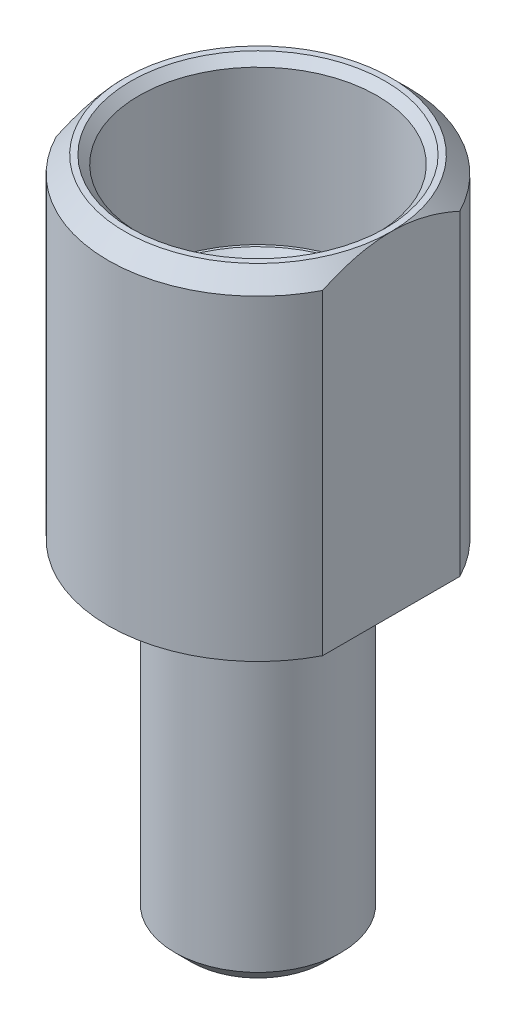
ISO-10303-21;
HEADER;
FILE_DESCRIPTION(('STEP AP214'),'2;1');
FILE_NAME('part.step','',(''),(''),'','','');
FILE_SCHEMA(('AUTOMOTIVE_DESIGN { 1 0 10303 214 1 1 1 1 }'));
ENDSEC;
DATA;
#1=APPLICATION_CONTEXT('core data for automotive mechanical design processes');
#2=APPLICATION_PROTOCOL_DEFINITION('international standard','automotive_design',2000,#1);
#3=PRODUCT_CONTEXT('',#1,'mechanical');
#4=PRODUCT('Part','Part','',(#3));
#5=PRODUCT_RELATED_PRODUCT_CATEGORY('part','',(#4));
#6=PRODUCT_DEFINITION_FORMATION('','',#4);
#7=PRODUCT_DEFINITION_CONTEXT('part definition',#1,'design');
#8=PRODUCT_DEFINITION('design','',#6,#7);
#9=PRODUCT_DEFINITION_SHAPE('','',#8);
#10=(LENGTH_UNIT() NAMED_UNIT(*) SI_UNIT(.MILLI.,.METRE.));
#11=(NAMED_UNIT(*) PLANE_ANGLE_UNIT() SI_UNIT($,.RADIAN.));
#12=(NAMED_UNIT(*) SI_UNIT($,.STERADIAN.) SOLID_ANGLE_UNIT());
#13=UNCERTAINTY_MEASURE_WITH_UNIT(LENGTH_MEASURE(1.E-05),#10,'distance_accuracy_value','');
#14=(GEOMETRIC_REPRESENTATION_CONTEXT(3) GLOBAL_UNCERTAINTY_ASSIGNED_CONTEXT((#13)) GLOBAL_UNIT_ASSIGNED_CONTEXT((#10,
#11,#12)) REPRESENTATION_CONTEXT('',''));
#15=CARTESIAN_POINT('',(0.,0.,0.));
#16=DIRECTION('',(0.,0.,1.));
#17=DIRECTION('',(1.,0.,0.));
#18=AXIS2_PLACEMENT_3D('',#15,#16,#17);
#19=CARTESIAN_POINT('',(0.,0.,0.));
#20=DIRECTION('',(0.,-1.,0.));
#21=DIRECTION('',(0.,0.,-1.));
#22=AXIS2_PLACEMENT_3D('',#19,#20,#21);
#23=CYLINDRICAL_SURFACE('',#22,9.);
#24=CARTESIAN_POINT('',(0.,39.,0.));
#25=DIRECTION('',(0.,-1.,0.));
#26=DIRECTION('',(0.,0.,-1.));
#27=AXIS2_PLACEMENT_3D('',#24,#25,#26);
#28=CIRCLE('',#27,9.);
#29=CARTESIAN_POINT('',(8.,39.,4.12310562561765));
#30=VERTEX_POINT('',#29);
#31=CARTESIAN_POINT('',(-8.,39.,4.12310562561765));
#32=VERTEX_POINT('',#31);
#33=EDGE_CURVE('E154',#30,#32,#28,.T.);
#34=ORIENTED_EDGE('',*,*,#33,.T.);
#35=DIRECTION('',(0.,1.,0.));
#36=VECTOR('',#35,1.);
#37=CARTESIAN_POINT('',(-8.,0.,4.12310562561765));
#38=LINE('',#37,#36);
#39=CARTESIAN_POINT('',(-8.,20.,4.12310562561765));
#40=VERTEX_POINT('',#39);
#41=EDGE_CURVE('E116',#40,#32,#38,.T.);
#42=ORIENTED_EDGE('',*,*,#41,.F.);
#43=CARTESIAN_POINT('',(0.,20.,0.));
#44=DIRECTION('',(0.,-1.,0.));
#45=DIRECTION('',(0.,0.,-1.));
#46=AXIS2_PLACEMENT_3D('',#43,#44,#45);
#47=CIRCLE('',#46,9.);
#48=CARTESIAN_POINT('',(8.,20.,4.12310562561765));
#49=VERTEX_POINT('',#48);
#50=EDGE_CURVE('E121',#49,#40,#47,.T.);
#51=ORIENTED_EDGE('',*,*,#50,.F.);
#52=DIRECTION('',(0.,1.,0.));
#53=VECTOR('',#52,1.);
#54=CARTESIAN_POINT('',(8.,0.,4.12310562561765));
#55=LINE('',#54,#53);
#56=EDGE_CURVE('E98',#49,#30,#55,.T.);
#57=ORIENTED_EDGE('',*,*,#56,.T.);
#58=EDGE_LOOP('',(#34,#42,#51,#57));
#59=FACE_BOUND('',#58,.T.);
#60=ADVANCED_FACE('F46',(#59),#23,.T.);
#61=CARTESIAN_POINT('',(0.,39.,0.));
#62=DIRECTION('',(0.,-1.,0.));
#63=DIRECTION('',(0.,0.,-1.));
#64=AXIS2_PLACEMENT_3D('',#61,#62,#63);
#65=CONICAL_SURFACE('',#64,9.,0.785398163397453);
#66=CARTESIAN_POINT('',(-8.,33.2181480493827,12.4299294885357));
#67=CARTESIAN_POINT('',(-8.,33.3818463030699,12.2352474434811));
#68=CARTESIAN_POINT('',(-8.,33.5448950331494,12.040017246731));
#69=CARTESIAN_POINT('',(-8.,33.8694986868849,11.6483108157981));
#70=CARTESIAN_POINT('',(-8.,34.0310535718163,11.451834549535));
#71=CARTESIAN_POINT('',(-8.,34.3525710989531,11.0573677092979));
#72=CARTESIAN_POINT('',(-8.,34.5125326340437,10.8593762313121));
#73=CARTESIAN_POINT('',(-8.,34.8304988824941,10.4618331323473));
#74=CARTESIAN_POINT('',(-8.,34.9885036054958,10.2622815190634));
#75=CARTESIAN_POINT('',(-8.,35.4726117615451,9.64383161527617));
#76=CARTESIAN_POINT('',(-8.,35.7949911644307,9.22198650844938));
#77=CARTESIAN_POINT('',(-8.,36.268505400316,8.5818654610533));
#78=CARTESIAN_POINT('',(-8.,36.4246505436815,8.3672909445678));
#79=CARTESIAN_POINT('',(-8.,36.7329619061923,7.93530605674869));
#80=CARTESIAN_POINT('',(-8.,36.8851282699699,7.71789578892904));
#81=CARTESIAN_POINT('',(-8.,37.1852361681748,7.27906777554689));
#82=CARTESIAN_POINT('',(-8.,37.3331612968286,7.05763878290673));
#83=CARTESIAN_POINT('',(-8.,37.623256100664,6.61102496852073));
#84=CARTESIAN_POINT('',(-8.,37.765425685528,6.38584008791454));
#85=CARTESIAN_POINT('',(-8.,38.0429255167555,5.93092414734763));
#86=CARTESIAN_POINT('',(-8.,38.1782477587553,5.70118818458595));
#87=CARTESIAN_POINT('',(-8.,38.4403008805279,5.23684897244185));
#88=CARTESIAN_POINT('',(-8.,38.5670319773709,5.00224584623247));
#89=CARTESIAN_POINT('',(-8.,38.8077359204346,4.5318657768293));
#90=CARTESIAN_POINT('',(-8.,38.9218973267641,4.29618594144992));
#91=CARTESIAN_POINT('',(-8.,39.1377123437989,3.81908393547211));
#92=CARTESIAN_POINT('',(-8.,39.2393643677206,3.5776610410065));
#93=CARTESIAN_POINT('',(-8.,39.4271407708728,3.08942561740604));
#94=CARTESIAN_POINT('',(-8.,39.5133003064061,2.84262675312447));
#95=CARTESIAN_POINT('',(-8.,39.667214178923,2.34342116832798));
#96=CARTESIAN_POINT('',(-8.,39.7349780271266,2.09101741904737));
#97=CARTESIAN_POINT('',(-8.,39.8492269797605,1.58026651883507));
#98=CARTESIAN_POINT('',(-8.,39.8956230649088,1.32189913002011));
#99=CARTESIAN_POINT('',(-8.,39.9640357896293,0.801921085412384));
#100=CARTESIAN_POINT('',(-8.,39.9860546193186,0.540310723112731));
#101=CARTESIAN_POINT('',(-8.,40.0042572285424,0.0165689221528463));
#102=CARTESIAN_POINT('',(-8.,40.0004797549196,-0.245561144048602));
#103=CARTESIAN_POINT('',(-8.,39.967436135758,-0.768204557289542));
#104=CARTESIAN_POINT('',(-8.,39.9381674964242,-1.02871774363867));
#105=CARTESIAN_POINT('',(-8.,39.8565434324942,-1.54254714673588));
#106=CARTESIAN_POINT('',(-8.,39.8044943133936,-1.79591291853018));
#107=CARTESIAN_POINT('',(-8.,39.6801601896176,-2.29757421349675));
#108=CARTESIAN_POINT('',(-8.,39.607873416244,-2.54586929147265));
#109=CARTESIAN_POINT('',(-8.,39.4452453371084,-3.03953954479759));
#110=CARTESIAN_POINT('',(-8.,39.3547088703772,-3.28484982544319));
#111=CARTESIAN_POINT('',(-8.,39.2080665116997,-3.64833909084017));
#112=CARTESIAN_POINT('',(-8.,39.157382465196,-3.76874980012877));
#113=CARTESIAN_POINT('',(-8.,39.0527326563112,-4.00813929451837));
#114=CARTESIAN_POINT('',(-8.,38.9987668853434,-4.12711807587178));
#115=CARTESIAN_POINT('',(-8.,38.8517606124282,-4.44072865001078));
#116=CARTESIAN_POINT('',(-8.,38.7561627239086,-4.63416304719205));
#117=CARTESIAN_POINT('',(-8.,38.5581460183558,-5.01752373693636));
#118=CARTESIAN_POINT('',(-8.,38.4557261521438,-5.20744948412646));
#119=CARTESIAN_POINT('',(-8.,38.24507179982,-5.58417688569442));
#120=CARTESIAN_POINT('',(-8.,38.1368341391236,-5.77097675996931));
#121=CARTESIAN_POINT('',(-8.,37.9154622308562,-6.1416585532977));
#122=CARTESIAN_POINT('',(-8.,37.8023276389121,-6.3255402658868));
#123=CARTESIAN_POINT('',(-8.,37.4558470125151,-6.87460824773022));
#124=CARTESIAN_POINT('',(-8.,37.216213608005,-7.23583020391604));
#125=CARTESIAN_POINT('',(-8.,36.7247876890803,-7.94967024468244));
#126=CARTESIAN_POINT('',(-8.,36.4729985907756,-8.30229070508717));
#127=CARTESIAN_POINT('',(-8.,35.9776001307123,-8.97701968525785));
#128=CARTESIAN_POINT('',(-8.,35.7345961236609,-9.29957430244527));
#129=CARTESIAN_POINT('',(-8.,35.2422893014344,-9.9398711947263));
#130=CARTESIAN_POINT('',(-8.,34.9929859296086,-10.2576130405377));
#131=CARTESIAN_POINT('',(-8.,34.4916251788093,-10.8863186981321));
#132=CARTESIAN_POINT('',(-8.,34.2396116916975,-11.1973176080265));
#133=CARTESIAN_POINT('',(-8.,33.7316335174595,-11.8159632407376));
#134=CARTESIAN_POINT('',(-8.,33.4756696873749,-12.1236106666351));
#135=CARTESIAN_POINT('',(-8.,33.2181480493827,-12.4299294885357));
#136=B_SPLINE_CURVE_WITH_KNOTS('',3,(#66,#67,#68,#69,#70,#71,#72,#73,#74,#75,#76,#77,#78,#79,
#80,#81,#82,#83,#84,#85,#86,#87,#88,#89,#90,#91,#92,#93,#94,#95,#96,#97,#98,#99,#100,#101,#102,
#103,#104,#105,#106,#107,#108,#109,#110,#111,#112,#113,#114,#115,#116,#117,#118,#119,#120,#121,
#122,#123,#124,#125,#126,#127,#128,#129,#130,#131,#132,#133,#134,#135),.UNSPECIFIED.,.F.,.F.,(4,
2,2,2,2,2,2,2,2,2,2,2,2,2,2,2,2,2,2,2,2,2,2,2,2,2,2,2,2,2,2,2,2,2,4),(0.,0.763075941616396,
1.52617160911908,2.28976493984222,3.05335450661181,4.64589298229265,5.44198182616952,
6.23804169114541,7.03685082259749,7.8356724843593,8.63540734006858,9.43512198155746,
10.2204444453131,11.0058664227841,11.7894829487936,12.5726935423712,13.359138158367,
14.145512112366,14.9307051685211,15.7159750485663,16.4909958915481,17.266084489724,
18.0499492938254,18.441839560362,18.8337308523193,19.4808628773215,20.1280946581209,
20.7756832706436,21.423317498599,22.7233691777126,24.0230576067624,25.2345017960948,
26.4460534130917,27.6468840095826,28.8474576450262),.UNSPECIFIED.);
#137=CARTESIAN_POINT('',(-8.,40.,0.));
#138=VERTEX_POINT('',#137);
#139=EDGE_CURVE('E71',#32,#138,#136,.T.);
#140=ORIENTED_EDGE('',*,*,#139,.F.);
#141=ORIENTED_EDGE('',*,*,#33,.F.);
#142=CARTESIAN_POINT('',(8.,33.2181480493827,-12.4299294885357));
#143=CARTESIAN_POINT('',(8.,33.3818463030699,-12.2352474434811));
#144=CARTESIAN_POINT('',(8.,33.5448950331494,-12.040017246731));
#145=CARTESIAN_POINT('',(8.,33.8694986868849,-11.6483108157981));
#146=CARTESIAN_POINT('',(8.,34.0310535718163,-11.451834549535));
#147=CARTESIAN_POINT('',(8.,34.3525710989531,-11.0573677092979));
#148=CARTESIAN_POINT('',(8.,34.5125326340437,-10.8593762313121));
#149=CARTESIAN_POINT('',(8.,34.8304988824941,-10.4618331323473));
#150=CARTESIAN_POINT('',(8.,34.9885036054958,-10.2622815190634));
#151=CARTESIAN_POINT('',(8.,35.4726117615451,-9.64383161527617));
#152=CARTESIAN_POINT('',(8.,35.7949911644307,-9.22198650844938));
#153=CARTESIAN_POINT('',(8.,36.268505400316,-8.5818654610533));
#154=CARTESIAN_POINT('',(8.,36.4246505436815,-8.3672909445678));
#155=CARTESIAN_POINT('',(8.,36.7329619061923,-7.93530605674869));
#156=CARTESIAN_POINT('',(8.,36.8851282699699,-7.71789578892904));
#157=CARTESIAN_POINT('',(8.,37.1852361681748,-7.27906777554689));
#158=CARTESIAN_POINT('',(8.,37.3331612968286,-7.05763878290673));
#159=CARTESIAN_POINT('',(8.,37.623256100664,-6.61102496852073));
#160=CARTESIAN_POINT('',(8.,37.765425685528,-6.38584008791454));
#161=CARTESIAN_POINT('',(8.,38.0429255167555,-5.93092414734763));
#162=CARTESIAN_POINT('',(8.,38.1782477587553,-5.70118818458595));
#163=CARTESIAN_POINT('',(8.,38.4403008805279,-5.23684897244185));
#164=CARTESIAN_POINT('',(8.,38.5670319773709,-5.00224584623247));
#165=CARTESIAN_POINT('',(8.,38.8077359204346,-4.5318657768293));
#166=CARTESIAN_POINT('',(8.,38.9218973267641,-4.29618594144992));
#167=CARTESIAN_POINT('',(8.,39.1377123437989,-3.81908393547211));
#168=CARTESIAN_POINT('',(8.,39.2393643677206,-3.5776610410065));
#169=CARTESIAN_POINT('',(8.,39.4271407708728,-3.08942561740604));
#170=CARTESIAN_POINT('',(8.,39.5133003064061,-2.84262675312447));
#171=CARTESIAN_POINT('',(8.,39.667214178923,-2.34342116832798));
#172=CARTESIAN_POINT('',(8.,39.7349780271266,-2.09101741904737));
#173=CARTESIAN_POINT('',(8.,39.8492269797605,-1.58026651883507));
#174=CARTESIAN_POINT('',(8.,39.8956230649088,-1.32189913002011));
#175=CARTESIAN_POINT('',(8.,39.9640357896293,-0.801921085412384));
#176=CARTESIAN_POINT('',(8.,39.9860546193186,-0.540310723112731));
#177=CARTESIAN_POINT('',(8.,40.0042572285424,-0.0165689221528463));
#178=CARTESIAN_POINT('',(8.,40.0004797549196,0.245561144048602));
#179=CARTESIAN_POINT('',(8.,39.967436135758,0.768204557289542));
#180=CARTESIAN_POINT('',(8.,39.9381674964242,1.02871774363867));
#181=CARTESIAN_POINT('',(8.,39.8565434324942,1.54254714673588));
#182=CARTESIAN_POINT('',(8.,39.8044943133936,1.79591291853018));
#183=CARTESIAN_POINT('',(8.,39.6801601896176,2.29757421349675));
#184=CARTESIAN_POINT('',(8.,39.607873416244,2.54586929147265));
#185=CARTESIAN_POINT('',(8.,39.4452453371084,3.03953954479759));
#186=CARTESIAN_POINT('',(8.,39.3547088703772,3.28484982544319));
#187=CARTESIAN_POINT('',(8.,39.2080665116997,3.64833909084017));
#188=CARTESIAN_POINT('',(8.,39.157382465196,3.76874980012877));
#189=CARTESIAN_POINT('',(8.,39.0527326563112,4.00813929451837));
#190=CARTESIAN_POINT('',(8.,38.9987668853434,4.12711807587178));
#191=CARTESIAN_POINT('',(8.,38.8517606124282,4.44072865001078));
#192=CARTESIAN_POINT('',(8.,38.7561627239086,4.63416304719205));
#193=CARTESIAN_POINT('',(8.,38.5581460183558,5.01752373693636));
#194=CARTESIAN_POINT('',(8.,38.4557261521438,5.20744948412646));
#195=CARTESIAN_POINT('',(8.,38.24507179982,5.58417688569442));
#196=CARTESIAN_POINT('',(8.,38.1368341391236,5.77097675996931));
#197=CARTESIAN_POINT('',(8.,37.9154622308562,6.1416585532977));
#198=CARTESIAN_POINT('',(8.,37.8023276389121,6.3255402658868));
#199=CARTESIAN_POINT('',(8.,37.4558470125151,6.87460824773022));
#200=CARTESIAN_POINT('',(8.,37.216213608005,7.23583020391604));
#201=CARTESIAN_POINT('',(8.,36.7247876890803,7.94967024468244));
#202=CARTESIAN_POINT('',(8.,36.4729985907756,8.30229070508717));
#203=CARTESIAN_POINT('',(8.,35.9776001307123,8.97701968525785));
#204=CARTESIAN_POINT('',(8.,35.7345961236609,9.29957430244527));
#205=CARTESIAN_POINT('',(8.,35.2422893014344,9.9398711947263));
#206=CARTESIAN_POINT('',(8.,34.9929859296086,10.2576130405377));
#207=CARTESIAN_POINT('',(8.,34.4916251788093,10.8863186981321));
#208=CARTESIAN_POINT('',(8.,34.2396116916975,11.1973176080265));
#209=CARTESIAN_POINT('',(8.,33.7316335174595,11.8159632407376));
#210=CARTESIAN_POINT('',(8.,33.4756696873749,12.1236106666351));
#211=CARTESIAN_POINT('',(8.,33.2181480493827,12.4299294885357));
#212=B_SPLINE_CURVE_WITH_KNOTS('',3,(#142,#143,#144,#145,#146,#147,#148,#149,#150,#151,#152,
#153,#154,#155,#156,#157,#158,#159,#160,#161,#162,#163,#164,#165,#166,#167,#168,#169,#170,#171,
#172,#173,#174,#175,#176,#177,#178,#179,#180,#181,#182,#183,#184,#185,#186,#187,#188,#189,#190,
#191,#192,#193,#194,#195,#196,#197,#198,#199,#200,#201,#202,#203,#204,#205,#206,#207,#208,#209,
#210,#211),.UNSPECIFIED.,.F.,.F.,(4,2,2,2,2,2,2,2,2,2,2,2,2,2,2,2,2,2,2,2,2,2,2,2,2,2,2,2,2,2,2,
2,2,2,4),(0.,0.763075941616396,1.52617160911908,2.28976493984222,3.05335450661181,
4.64589298229265,5.44198182616952,6.23804169114541,7.03685082259749,7.8356724843593,
8.63540734006858,9.43512198155746,10.2204444453131,11.0058664227841,11.7894829487936,
12.5726935423712,13.359138158367,14.145512112366,14.9307051685211,15.7159750485663,
16.4909958915481,17.266084489724,18.0499492938254,18.441839560362,18.8337308523193,
19.4808628773215,20.1280946581209,20.7756832706436,21.423317498599,22.7233691777126,
24.0230576067624,25.2345017960948,26.4460534130917,27.6468840095826,28.8474576450262),.UNSPECIFIED.);
#213=CARTESIAN_POINT('',(8.,40.,0.));
#214=VERTEX_POINT('',#213);
#215=EDGE_CURVE('E159',#214,#30,#212,.T.);
#216=ORIENTED_EDGE('',*,*,#215,.F.);
#217=CARTESIAN_POINT('',(0.,40.,0.));
#218=DIRECTION('',(0.,-1.,0.));
#219=DIRECTION('',(0.,0.,-1.));
#220=AXIS2_PLACEMENT_3D('',#217,#218,#219);
#221=CIRCLE('',#220,8.);
#222=EDGE_CURVE('E155',#138,#214,#221,.F.);
#223=ORIENTED_EDGE('',*,*,#222,.F.);
#224=EDGE_LOOP('',(#140,#141,#216,#223));
#225=FACE_BOUND('',#224,.T.);
#226=ADVANCED_FACE('F240',(#225),#65,.T.);
#227=CARTESIAN_POINT('',(0.,0.,0.));
#228=DIRECTION('',(0.,-1.,0.));
#229=DIRECTION('',(0.,0.,-1.));
#230=AXIS2_PLACEMENT_3D('',#227,#228,#229);
#231=CYLINDRICAL_SURFACE('',#230,5.);
#232=CARTESIAN_POINT('',(0.,0.999999999999995,0.));
#233=DIRECTION('',(0.,1.,0.));
#234=DIRECTION('',(0.,0.,1.));
#235=AXIS2_PLACEMENT_3D('',#232,#233,#234);
#236=CIRCLE('',#235,5.);
#237=CARTESIAN_POINT('',(0.,0.999999999999995,5.));
#238=VERTEX_POINT('',#237);
#239=EDGE_CURVE('E530',#238,#238,#236,.T.);
#240=ORIENTED_EDGE('',*,*,#239,.T.);
#241=EDGE_LOOP('',(#240));
#242=FACE_BOUND('',#241,.T.);
#243=CARTESIAN_POINT('',(0.,20.,0.));
#244=DIRECTION('',(0.,-1.,0.));
#245=DIRECTION('',(0.,0.,-1.));
#246=AXIS2_PLACEMENT_3D('',#243,#244,#245);
#247=CIRCLE('',#246,5.);
#248=CARTESIAN_POINT('',(0.,20.,-5.));
#249=VERTEX_POINT('',#248);
#250=EDGE_CURVE('E148',#249,#249,#247,.T.);
#251=ORIENTED_EDGE('',*,*,#250,.T.);
#252=EDGE_LOOP('',(#251));
#253=FACE_BOUND('',#252,.T.);
#254=ADVANCED_FACE('F237',(#242,#253),#231,.T.);
#255=CARTESIAN_POINT('',(0.,20.,0.));
#256=DIRECTION('',(0.,-1.,0.));
#257=DIRECTION('',(0.,0.,-1.));
#258=AXIS2_PLACEMENT_3D('',#255,#256,#257);
#259=PLANE('',#258);
#260=CARTESIAN_POINT('',(0.,20.,0.));
#261=DIRECTION('',(0.,-1.,0.));
#262=DIRECTION('',(0.,0.,-1.));
#263=AXIS2_PLACEMENT_3D('',#260,#261,#262);
#264=CIRCLE('',#263,5.5);
#265=CARTESIAN_POINT('',(0.,20.,-5.5));
#266=VERTEX_POINT('',#265);
#267=EDGE_CURVE('E144',#266,#266,#264,.T.);
#268=ORIENTED_EDGE('',*,*,#267,.T.);
#269=EDGE_LOOP('',(#268));
#270=FACE_BOUND('',#269,.T.);
#271=ORIENTED_EDGE('',*,*,#250,.F.);
#272=EDGE_LOOP('',(#271));
#273=FACE_BOUND('',#272,.T.);
#274=ADVANCED_FACE('F234',(#270,#273),#259,.T.);
#275=CARTESIAN_POINT('',(0.,0.,0.));
#276=DIRECTION('',(0.,-1.,0.));
#277=DIRECTION('',(0.,0.,-1.));
#278=AXIS2_PLACEMENT_3D('',#275,#276,#277);
#279=CYLINDRICAL_SURFACE('',#278,5.5);
#280=ORIENTED_EDGE('',*,*,#267,.F.);
#281=EDGE_LOOP('',(#280));
#282=FACE_BOUND('',#281,.T.);
#283=CARTESIAN_POINT('',(0.,21.22,0.));
#284=DIRECTION('',(0.,-1.,0.));
#285=DIRECTION('',(0.,0.,-1.));
#286=AXIS2_PLACEMENT_3D('',#283,#284,#285);
#287=CIRCLE('',#286,5.5);
#288=CARTESIAN_POINT('',(0.,21.22,-5.5));
#289=VERTEX_POINT('',#288);
#290=EDGE_CURVE('E140',#289,#289,#287,.T.);
#291=ORIENTED_EDGE('',*,*,#290,.T.);
#292=EDGE_LOOP('',(#291));
#293=FACE_BOUND('',#292,.T.);
#294=ADVANCED_FACE('F230',(#282,#293),#279,.T.);
#295=CARTESIAN_POINT('',(0.,21.22,0.));
#296=DIRECTION('',(0.,1.,0.));
#297=DIRECTION('',(0.,0.,1.));
#298=AXIS2_PLACEMENT_3D('',#295,#296,#297);
#299=PLANE('',#298);
#300=ORIENTED_EDGE('',*,*,#290,.F.);
#301=EDGE_LOOP('',(#300));
#302=FACE_BOUND('',#301,.T.);
#303=CARTESIAN_POINT('',(0.,21.22,0.));
#304=DIRECTION('',(0.,-1.,0.));
#305=DIRECTION('',(0.,0.,-1.));
#306=AXIS2_PLACEMENT_3D('',#303,#304,#305);
#307=CIRCLE('',#306,7.6);
#308=CARTESIAN_POINT('',(0.,21.22,-7.6));
#309=VERTEX_POINT('',#308);
#310=EDGE_CURVE('E136',#309,#309,#307,.T.);
#311=ORIENTED_EDGE('',*,*,#310,.T.);
#312=EDGE_LOOP('',(#311));
#313=FACE_BOUND('',#312,.T.);
#314=ADVANCED_FACE('F226',(#302,#313),#299,.F.);
#315=CARTESIAN_POINT('',(0.,0.,0.));
#316=DIRECTION('',(0.,-1.,0.));
#317=DIRECTION('',(0.,0.,-1.));
#318=AXIS2_PLACEMENT_3D('',#315,#316,#317);
#319=CYLINDRICAL_SURFACE('',#318,7.6);
#320=ORIENTED_EDGE('',*,*,#310,.F.);
#321=EDGE_LOOP('',(#320));
#322=FACE_BOUND('',#321,.T.);
#323=CARTESIAN_POINT('',(0.,20.,0.));
#324=DIRECTION('',(0.,-1.,0.));
#325=DIRECTION('',(0.,0.,-1.));
#326=AXIS2_PLACEMENT_3D('',#323,#324,#325);
#327=CIRCLE('',#326,7.6);
#328=CARTESIAN_POINT('',(0.,20.,-7.6));
#329=VERTEX_POINT('',#328);
#330=EDGE_CURVE('E127',#329,#329,#327,.T.);
#331=ORIENTED_EDGE('',*,*,#330,.T.);
#332=EDGE_LOOP('',(#331));
#333=FACE_BOUND('',#332,.T.);
#334=ADVANCED_FACE('F222',(#322,#333),#319,.F.);
#335=CARTESIAN_POINT('',(0.,20.,0.));
#336=DIRECTION('',(0.,1.,0.));
#337=DIRECTION('',(0.,0.,1.));
#338=AXIS2_PLACEMENT_3D('',#335,#336,#337);
#339=PLANE('',#338);
#340=ORIENTED_EDGE('',*,*,#330,.F.);
#341=EDGE_LOOP('',(#340));
#342=FACE_BOUND('',#341,.T.);
#343=ORIENTED_EDGE('',*,*,#50,.T.);
#344=DIRECTION('',(0.,0.,-1.));
#345=VECTOR('',#344,1.);
#346=CARTESIAN_POINT('',(-8.,20.,0.));
#347=LINE('',#346,#345);
#348=CARTESIAN_POINT('',(-8.,20.,-4.12310562561765));
#349=VERTEX_POINT('',#348);
#350=EDGE_CURVE('E104',#40,#349,#347,.T.);
#351=ORIENTED_EDGE('',*,*,#350,.T.);
#352=CARTESIAN_POINT('',(8.,20.,-4.12310562561765));
#353=VERTEX_POINT('',#352);
#354=EDGE_CURVE('E112',#349,#353,#47,.T.);
#355=ORIENTED_EDGE('',*,*,#354,.T.);
#356=DIRECTION('',(0.,0.,1.));
#357=VECTOR('',#356,1.);
#358=CARTESIAN_POINT('',(8.,20.,0.));
#359=LINE('',#358,#357);
#360=EDGE_CURVE('E93',#353,#49,#359,.T.);
#361=ORIENTED_EDGE('',*,*,#360,.T.);
#362=EDGE_LOOP('',(#343,#351,#355,#361));
#363=FACE_BOUND('',#362,.T.);
#364=ADVANCED_FACE('F119',(#342,#363),#339,.F.);
#365=ORIENTED_EDGE('',*,*,#354,.F.);
#366=DIRECTION('',(0.,1.,0.));
#367=VECTOR('',#366,1.);
#368=CARTESIAN_POINT('',(-8.,0.,-4.12310562561765));
#369=LINE('',#368,#367);
#370=CARTESIAN_POINT('',(-8.,39.,-4.12310562561765));
#371=VERTEX_POINT('',#370);
#372=EDGE_CURVE('E105',#349,#371,#369,.T.);
#373=ORIENTED_EDGE('',*,*,#372,.T.);
#374=CARTESIAN_POINT('',(8.,39.,-4.12310562561765));
#375=VERTEX_POINT('',#374);
#376=EDGE_CURVE('E114',#371,#375,#28,.T.);
#377=ORIENTED_EDGE('',*,*,#376,.T.);
#378=DIRECTION('',(0.,1.,0.));
#379=VECTOR('',#378,1.);
#380=CARTESIAN_POINT('',(8.,0.,-4.12310562561765));
#381=LINE('',#380,#379);
#382=EDGE_CURVE('E96',#353,#375,#381,.T.);
#383=ORIENTED_EDGE('',*,*,#382,.F.);
#384=EDGE_LOOP('',(#365,#373,#377,#383));
#385=FACE_BOUND('',#384,.T.);
#386=ADVANCED_FACE('F110',(#385),#23,.T.);
#387=CARTESIAN_POINT('',(0.,40.,0.));
#388=DIRECTION('',(0.,-1.,0.));
#389=DIRECTION('',(0.,0.,-1.));
#390=AXIS2_PLACEMENT_3D('',#387,#388,#389);
#391=PLANE('',#390);
#392=CARTESIAN_POINT('',(0.,40.,0.));
#393=DIRECTION('',(0.,-1.,0.));
#394=DIRECTION('',(0.,0.,-1.));
#395=AXIS2_PLACEMENT_3D('',#392,#393,#394);
#396=CIRCLE('',#395,7.64999999999999);
#397=CARTESIAN_POINT('',(0.,40.,-7.64999999999999));
#398=VERTEX_POINT('',#397);
#399=EDGE_CURVE('E265',#398,#398,#396,.T.);
#400=ORIENTED_EDGE('',*,*,#399,.T.);
#401=EDGE_LOOP('',(#400));
#402=FACE_BOUND('',#401,.T.);
#403=ORIENTED_EDGE('',*,*,#222,.T.);
#404=EDGE_CURVE('E160',#214,#138,#221,.F.);
#405=ORIENTED_EDGE('',*,*,#404,.T.);
#406=EDGE_LOOP('',(#403,#405));
#407=FACE_BOUND('',#406,.T.);
#408=ADVANCED_FACE('F213',(#402,#407),#391,.F.);
#409=CARTESIAN_POINT('',(0.,0.,0.));
#410=DIRECTION('',(0.,-1.,0.));
#411=DIRECTION('',(0.,0.,-1.));
#412=AXIS2_PLACEMENT_3D('',#409,#410,#411);
#413=CYLINDRICAL_SURFACE('',#412,7.15);
#414=CARTESIAN_POINT('',(0.,39.5,0.));
#415=DIRECTION('',(0.,-1.,0.));
#416=DIRECTION('',(0.,0.,-1.));
#417=AXIS2_PLACEMENT_3D('',#414,#415,#416);
#418=CIRCLE('',#417,7.15);
#419=CARTESIAN_POINT('',(0.,39.5,-7.15));
#420=VERTEX_POINT('',#419);
#421=EDGE_CURVE('E270',#420,#420,#418,.F.);
#422=ORIENTED_EDGE('',*,*,#421,.T.);
#423=EDGE_LOOP('',(#422));
#424=FACE_BOUND('',#423,.T.);
#425=CARTESIAN_POINT('',(0.,30.27,0.));
#426=DIRECTION('',(0.,-1.,0.));
#427=DIRECTION('',(0.,0.,-1.));
#428=AXIS2_PLACEMENT_3D('',#425,#426,#427);
#429=CIRCLE('',#428,7.15);
#430=CARTESIAN_POINT('',(0.,30.27,-7.15));
#431=VERTEX_POINT('',#430);
#432=EDGE_CURVE('E122',#431,#431,#429,.T.);
#433=ORIENTED_EDGE('',*,*,#432,.T.);
#434=EDGE_LOOP('',(#433));
#435=FACE_BOUND('',#434,.T.);
#436=ADVANCED_FACE('F209',(#424,#435),#413,.F.);
#437=CARTESIAN_POINT('',(1.61569475747132E-13,30.27,0.));
#438=DIRECTION('',(0.,-1.,0.));
#439=DIRECTION('',(0.,0.,-1.));
#440=AXIS2_PLACEMENT_3D('',#437,#438,#439);
#441=PLANE('',#440);
#442=CARTESIAN_POINT('',(0.,30.27,0.));
#443=DIRECTION('',(0.,-1.,0.));
#444=DIRECTION('',(0.,0.,-1.));
#445=AXIS2_PLACEMENT_3D('',#442,#443,#444);
#446=CIRCLE('',#445,6.99999999999999);
#447=CARTESIAN_POINT('',(0.,30.27,-6.99999999999999));
#448=VERTEX_POINT('',#447);
#449=EDGE_CURVE('E512',#448,#448,#446,.T.);
#450=ORIENTED_EDGE('',*,*,#449,.T.);
#451=EDGE_LOOP('',(#450));
#452=FACE_BOUND('',#451,.T.);
#453=ORIENTED_EDGE('',*,*,#432,.F.);
#454=EDGE_LOOP('',(#453));
#455=FACE_BOUND('',#454,.T.);
#456=ADVANCED_FACE('F205',(#452,#455),#441,.F.);
#457=CARTESIAN_POINT('',(0.,0.,0.));
#458=DIRECTION('',(0.,-1.,0.));
#459=DIRECTION('',(0.,0.,-1.));
#460=AXIS2_PLACEMENT_3D('',#457,#458,#459);
#461=CYLINDRICAL_SURFACE('',#460,6.5);
#462=CARTESIAN_POINT('',(0.,29.77,0.));
#463=DIRECTION('',(0.,-1.,0.));
#464=DIRECTION('',(0.,0.,-1.));
#465=AXIS2_PLACEMENT_3D('',#462,#463,#464);
#466=CIRCLE('',#465,6.5);
#467=CARTESIAN_POINT('',(0.,29.77,-6.5));
#468=VERTEX_POINT('',#467);
#469=EDGE_CURVE('E56',#468,#468,#466,.F.);
#470=ORIENTED_EDGE('',*,*,#469,.T.);
#471=EDGE_LOOP('',(#470));
#472=FACE_BOUND('',#471,.T.);
#473=CARTESIAN_POINT('',(0.,22.77,0.));
#474=DIRECTION('',(0.,-1.,0.));
#475=DIRECTION('',(0.,0.,-1.));
#476=AXIS2_PLACEMENT_3D('',#473,#474,#475);
#477=CIRCLE('',#476,6.5);
#478=CARTESIAN_POINT('',(0.,22.77,-6.5));
#479=VERTEX_POINT('',#478);
#480=EDGE_CURVE('E129',#479,#479,#477,.T.);
#481=ORIENTED_EDGE('',*,*,#480,.T.);
#482=EDGE_LOOP('',(#481));
#483=FACE_BOUND('',#482,.T.);
#484=ADVANCED_FACE('F201',(#472,#483),#461,.F.);
#485=CARTESIAN_POINT('',(0.,22.77,0.));
#486=DIRECTION('',(0.,-1.,0.));
#487=DIRECTION('',(0.,0.,-1.));
#488=AXIS2_PLACEMENT_3D('',#485,#486,#487);
#489=PLANE('',#488);
#490=CARTESIAN_POINT('',(0.,22.77,0.));
#491=DIRECTION('',(0.,-1.,0.));
#492=DIRECTION('',(0.,0.,-1.));
#493=AXIS2_PLACEMENT_3D('',#490,#491,#492);
#494=CIRCLE('',#493,4.26999999999999);
#495=CARTESIAN_POINT('',(0.,22.77,-4.26999999999999));
#496=VERTEX_POINT('',#495);
#497=EDGE_CURVE('E541',#496,#496,#494,.T.);
#498=ORIENTED_EDGE('',*,*,#497,.T.);
#499=EDGE_LOOP('',(#498));
#500=FACE_BOUND('',#499,.T.);
#501=ORIENTED_EDGE('',*,*,#480,.F.);
#502=EDGE_LOOP('',(#501));
#503=FACE_BOUND('',#502,.T.);
#504=ADVANCED_FACE('F197',(#500,#503),#489,.F.);
#505=CARTESIAN_POINT('',(0.,0.,0.));
#506=DIRECTION('',(0.,-1.,0.));
#507=DIRECTION('',(0.,0.,-1.));
#508=AXIS2_PLACEMENT_3D('',#505,#506,#507);
#509=CYLINDRICAL_SURFACE('',#508,2.77);
#510=CARTESIAN_POINT('',(0.,10.5,0.));
#511=DIRECTION('',(0.,1.,0.));
#512=DIRECTION('',(0.,0.,1.));
#513=AXIS2_PLACEMENT_3D('',#510,#511,#512);
#514=CIRCLE('',#513,2.77);
#515=CARTESIAN_POINT('',(0.,10.5,2.77));
#516=VERTEX_POINT('',#515);
#517=EDGE_CURVE('E514',#516,#516,#514,.F.);
#518=ORIENTED_EDGE('',*,*,#517,.T.);
#519=EDGE_LOOP('',(#518));
#520=FACE_BOUND('',#519,.T.);
#521=CARTESIAN_POINT('',(0.,21.27,0.));
#522=DIRECTION('',(0.,-1.,0.));
#523=DIRECTION('',(0.,0.,-1.));
#524=AXIS2_PLACEMENT_3D('',#521,#522,#523);
#525=CIRCLE('',#524,2.77);
#526=CARTESIAN_POINT('',(0.,21.27,-2.77));
#527=VERTEX_POINT('',#526);
#528=EDGE_CURVE('E537',#527,#527,#525,.F.);
#529=ORIENTED_EDGE('',*,*,#528,.T.);
#530=EDGE_LOOP('',(#529));
#531=FACE_BOUND('',#530,.T.);
#532=ADVANCED_FACE('F193',(#520,#531),#509,.F.);
#533=CARTESIAN_POINT('',(0.,0.,0.));
#534=DIRECTION('',(0.,-1.,0.));
#535=DIRECTION('',(0.,0.,-1.));
#536=AXIS2_PLACEMENT_3D('',#533,#534,#535);
#537=CYLINDRICAL_SURFACE('',#536,3.1);
#538=CARTESIAN_POINT('',(0.,10.17,0.));
#539=DIRECTION('',(0.,-1.,0.));
#540=DIRECTION('',(0.,0.,-1.));
#541=AXIS2_PLACEMENT_3D('',#538,#539,#540);
#542=CIRCLE('',#541,3.1);
#543=CARTESIAN_POINT('',(0.,10.17,-3.1));
#544=VERTEX_POINT('',#543);
#545=EDGE_CURVE('E12',#544,#544,#542,.F.);
#546=ORIENTED_EDGE('',*,*,#545,.T.);
#547=EDGE_LOOP('',(#546));
#548=FACE_BOUND('',#547,.T.);
#549=CARTESIAN_POINT('',(0.,0.699999999999988,0.));
#550=DIRECTION('',(0.,1.,0.));
#551=DIRECTION('',(0.,0.,1.));
#552=AXIS2_PLACEMENT_3D('',#549,#550,#551);
#553=CIRCLE('',#552,3.1);
#554=CARTESIAN_POINT('',(0.,0.699999999999988,3.1));
#555=VERTEX_POINT('',#554);
#556=EDGE_CURVE('E526',#555,#555,#553,.F.);
#557=ORIENTED_EDGE('',*,*,#556,.T.);
#558=EDGE_LOOP('',(#557));
#559=FACE_BOUND('',#558,.T.);
#560=ADVANCED_FACE('F189',(#548,#559),#537,.F.);
#561=CARTESIAN_POINT('',(0.,0.,0.));
#562=DIRECTION('',(0.,1.,0.));
#563=DIRECTION('',(0.,0.,1.));
#564=AXIS2_PLACEMENT_3D('',#561,#562,#563);
#565=PLANE('',#564);
#566=CARTESIAN_POINT('',(0.,0.,0.));
#567=DIRECTION('',(0.,1.,0.));
#568=DIRECTION('',(0.,0.,1.));
#569=AXIS2_PLACEMENT_3D('',#566,#567,#568);
#570=CIRCLE('',#569,3.79999999999999);
#571=CARTESIAN_POINT('',(0.,0.,3.79999999999999));
#572=VERTEX_POINT('',#571);
#573=EDGE_CURVE('E520',#572,#572,#570,.T.);
#574=ORIENTED_EDGE('',*,*,#573,.T.);
#575=EDGE_LOOP('',(#574));
#576=FACE_BOUND('',#575,.T.);
#577=CARTESIAN_POINT('',(0.,0.,0.));
#578=DIRECTION('',(0.,1.,0.));
#579=DIRECTION('',(0.,0.,1.));
#580=AXIS2_PLACEMENT_3D('',#577,#578,#579);
#581=CIRCLE('',#580,4.00000000000001);
#582=CARTESIAN_POINT('',(0.,0.,4.00000000000001));
#583=VERTEX_POINT('',#582);
#584=EDGE_CURVE('E533',#583,#583,#581,.F.);
#585=ORIENTED_EDGE('',*,*,#584,.T.);
#586=EDGE_LOOP('',(#585));
#587=FACE_BOUND('',#586,.T.);
#588=ADVANCED_FACE('F186',(#576,#587),#565,.F.);
#589=EDGE_CURVE('E169',#138,#371,#136,.T.);
#590=ORIENTED_EDGE('',*,*,#589,.F.);
#591=ORIENTED_EDGE('',*,*,#404,.F.);
#592=EDGE_CURVE('E63',#375,#214,#212,.T.);
#593=ORIENTED_EDGE('',*,*,#592,.F.);
#594=ORIENTED_EDGE('',*,*,#376,.F.);
#595=EDGE_LOOP('',(#590,#591,#593,#594));
#596=FACE_BOUND('',#595,.T.);
#597=ADVANCED_FACE('F177',(#596),#65,.T.);
#598=CARTESIAN_POINT('',(8.,0.,-4.12310562561765));
#599=DIRECTION('',(-1.,0.,0.));
#600=DIRECTION('',(0.,0.,1.));
#601=AXIS2_PLACEMENT_3D('',#598,#599,#600);
#602=PLANE('',#601);
#603=ORIENTED_EDGE('',*,*,#382,.T.);
#604=ORIENTED_EDGE('',*,*,#592,.T.);
#605=ORIENTED_EDGE('',*,*,#215,.T.);
#606=ORIENTED_EDGE('',*,*,#56,.F.);
#607=ORIENTED_EDGE('',*,*,#360,.F.);
#608=EDGE_LOOP('',(#603,#604,#605,#606,#607));
#609=FACE_BOUND('',#608,.T.);
#610=ADVANCED_FACE('F95',(#609),#602,.F.);
#611=CARTESIAN_POINT('',(-8.,0.,-4.12310562561765));
#612=DIRECTION('',(1.,0.,0.));
#613=DIRECTION('',(0.,0.,-1.));
#614=AXIS2_PLACEMENT_3D('',#611,#612,#613);
#615=PLANE('',#614);
#616=ORIENTED_EDGE('',*,*,#41,.T.);
#617=ORIENTED_EDGE('',*,*,#139,.T.);
#618=ORIENTED_EDGE('',*,*,#589,.T.);
#619=ORIENTED_EDGE('',*,*,#372,.F.);
#620=ORIENTED_EDGE('',*,*,#350,.F.);
#621=EDGE_LOOP('',(#616,#617,#618,#619,#620));
#622=FACE_BOUND('',#621,.T.);
#623=ADVANCED_FACE('F184',(#622),#615,.F.);
#624=CARTESIAN_POINT('',(0.,40.,0.));
#625=DIRECTION('',(0.,1.,0.));
#626=DIRECTION('',(0.,0.,1.));
#627=AXIS2_PLACEMENT_3D('',#624,#625,#626);
#628=CONICAL_SURFACE('',#627,7.64999999999999,0.785398163397441);
#629=ORIENTED_EDGE('',*,*,#421,.F.);
#630=EDGE_LOOP('',(#629));
#631=FACE_BOUND('',#630,.T.);
#632=ORIENTED_EDGE('',*,*,#399,.F.);
#633=EDGE_LOOP('',(#632));
#634=FACE_BOUND('',#633,.T.);
#635=ADVANCED_FACE('F294',(#631,#634),#628,.F.);
#636=CARTESIAN_POINT('',(0.,22.77,0.));
#637=DIRECTION('',(0.,1.,0.));
#638=DIRECTION('',(0.,0.,1.));
#639=AXIS2_PLACEMENT_3D('',#636,#637,#638);
#640=CONICAL_SURFACE('',#639,4.26999999999999,0.785398163397447);
#641=ORIENTED_EDGE('',*,*,#528,.F.);
#642=EDGE_LOOP('',(#641));
#643=FACE_BOUND('',#642,.T.);
#644=ORIENTED_EDGE('',*,*,#497,.F.);
#645=EDGE_LOOP('',(#644));
#646=FACE_BOUND('',#645,.T.);
#647=ADVANCED_FACE('F301',(#643,#646),#640,.F.);
#648=CARTESIAN_POINT('',(0.,0.,0.));
#649=DIRECTION('',(0.,1.,0.));
#650=DIRECTION('',(0.,0.,1.));
#651=AXIS2_PLACEMENT_3D('',#648,#649,#650);
#652=CONICAL_SURFACE('',#651,4.00000000000001,0.785398163397447);
#653=ORIENTED_EDGE('',*,*,#239,.F.);
#654=EDGE_LOOP('',(#653));
#655=FACE_BOUND('',#654,.T.);
#656=ORIENTED_EDGE('',*,*,#584,.F.);
#657=EDGE_LOOP('',(#656));
#658=FACE_BOUND('',#657,.T.);
#659=ADVANCED_FACE('F310',(#655,#658),#652,.T.);
#660=CARTESIAN_POINT('',(0.,0.699999999999988,0.));
#661=DIRECTION('',(0.,-1.,0.));
#662=DIRECTION('',(0.,0.,-1.));
#663=AXIS2_PLACEMENT_3D('',#660,#661,#662);
#664=CONICAL_SURFACE('',#663,3.1,0.78539816339745);
#665=ORIENTED_EDGE('',*,*,#573,.F.);
#666=EDGE_LOOP('',(#665));
#667=FACE_BOUND('',#666,.T.);
#668=ORIENTED_EDGE('',*,*,#556,.F.);
#669=EDGE_LOOP('',(#668));
#670=FACE_BOUND('',#669,.T.);
#671=ADVANCED_FACE('F318',(#667,#670),#664,.F.);
#672=CARTESIAN_POINT('',(0.,10.5,0.));
#673=DIRECTION('',(0.,-1.,0.));
#674=DIRECTION('',(0.,0.,-1.));
#675=AXIS2_PLACEMENT_3D('',#672,#673,#674);
#676=CONICAL_SURFACE('',#675,2.77,0.785398163397443);
#677=ORIENTED_EDGE('',*,*,#545,.F.);
#678=EDGE_LOOP('',(#677));
#679=FACE_BOUND('',#678,.T.);
#680=ORIENTED_EDGE('',*,*,#517,.F.);
#681=EDGE_LOOP('',(#680));
#682=FACE_BOUND('',#681,.T.);
#683=ADVANCED_FACE('F326',(#679,#682),#676,.F.);
#684=CARTESIAN_POINT('',(0.,30.27,0.));
#685=DIRECTION('',(0.,1.,0.));
#686=DIRECTION('',(0.,0.,1.));
#687=AXIS2_PLACEMENT_3D('',#684,#685,#686);
#688=CONICAL_SURFACE('',#687,6.99999999999999,0.785398163397444);
#689=ORIENTED_EDGE('',*,*,#469,.F.);
#690=EDGE_LOOP('',(#689));
#691=FACE_BOUND('',#690,.T.);
#692=ORIENTED_EDGE('',*,*,#449,.F.);
#693=EDGE_LOOP('',(#692));
#694=FACE_BOUND('',#693,.T.);
#695=ADVANCED_FACE('F49',(#691,#694),#688,.F.);
#696=CLOSED_SHELL('',(#60,#226,#254,#274,#294,#314,#334,#364,#386,#408,#436,#456,#484,#504,#532,
#560,#588,#597,#610,#623,#635,#647,#659,#671,#683,#695));
#697=MANIFOLD_SOLID_BREP('B2',#696);
#698=ADVANCED_BREP_SHAPE_REPRESENTATION('',(#18,#697),#14);
#699=SHAPE_DEFINITION_REPRESENTATION(#9,#698);
ENDSEC;
END-ISO-10303-21;
